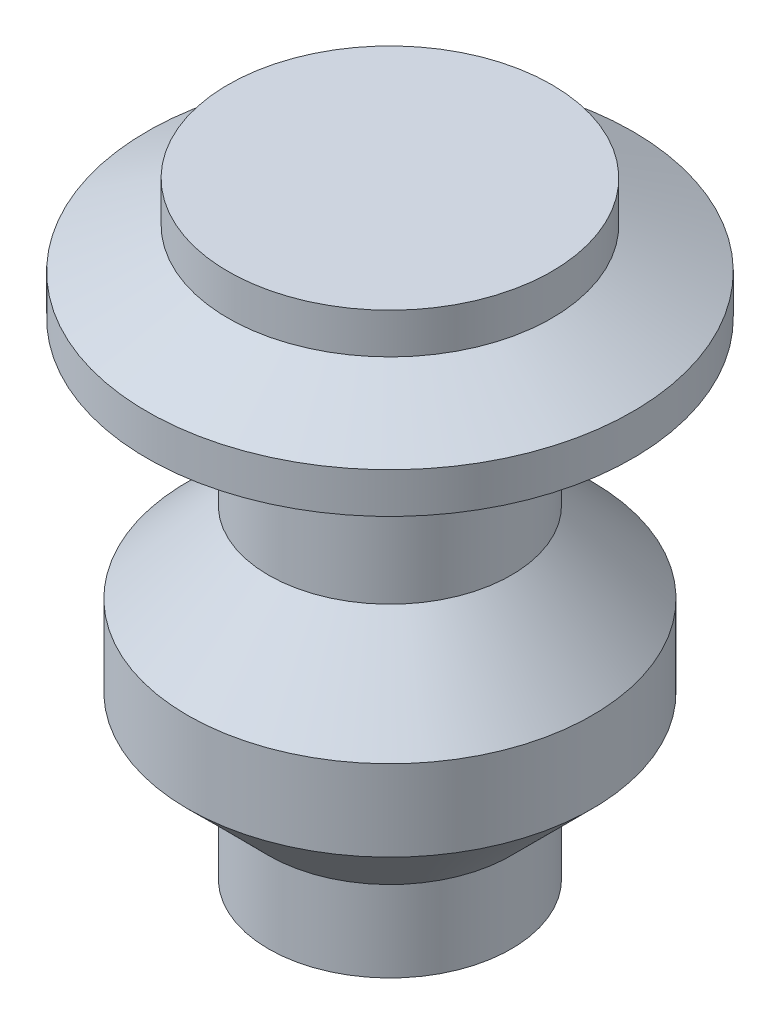
ISO-10303-21;
HEADER;
FILE_DESCRIPTION(('STEP AP214'),'2;1');
FILE_NAME('part.step','',(''),(''),'','','');
FILE_SCHEMA(('AUTOMOTIVE_DESIGN { 1 0 10303 214 1 1 1 1 }'));
ENDSEC;
DATA;
#1=APPLICATION_CONTEXT('core data for automotive mechanical design processes');
#2=APPLICATION_PROTOCOL_DEFINITION('international standard','automotive_design',2000,#1);
#3=PRODUCT_CONTEXT('',#1,'mechanical');
#4=PRODUCT('Part','Part','',(#3));
#5=PRODUCT_RELATED_PRODUCT_CATEGORY('part','',(#4));
#6=PRODUCT_DEFINITION_FORMATION('','',#4);
#7=PRODUCT_DEFINITION_CONTEXT('part definition',#1,'design');
#8=PRODUCT_DEFINITION('design','',#6,#7);
#9=PRODUCT_DEFINITION_SHAPE('','',#8);
#10=(LENGTH_UNIT() NAMED_UNIT(*) SI_UNIT(.MILLI.,.METRE.));
#11=(NAMED_UNIT(*) PLANE_ANGLE_UNIT() SI_UNIT($,.RADIAN.));
#12=(NAMED_UNIT(*) SI_UNIT($,.STERADIAN.) SOLID_ANGLE_UNIT());
#13=UNCERTAINTY_MEASURE_WITH_UNIT(LENGTH_MEASURE(1.E-05),#10,'distance_accuracy_value','');
#14=(GEOMETRIC_REPRESENTATION_CONTEXT(3) GLOBAL_UNCERTAINTY_ASSIGNED_CONTEXT((#13)) GLOBAL_UNIT_ASSIGNED_CONTEXT((#10,
#11,#12)) REPRESENTATION_CONTEXT('',''));
#15=CARTESIAN_POINT('',(0.,0.,0.));
#16=DIRECTION('',(0.,0.,1.));
#17=DIRECTION('',(1.,0.,0.));
#18=AXIS2_PLACEMENT_3D('',#15,#16,#17);
#19=CARTESIAN_POINT('',(0.,0.,0.));
#20=DIRECTION('',(0.,-1.,0.));
#21=DIRECTION('',(0.,0.,-1.));
#22=AXIS2_PLACEMENT_3D('',#19,#20,#21);
#23=PLANE('',#22);
#24=CARTESIAN_POINT('',(0.,0.,0.));
#25=DIRECTION('',(0.,-1.,0.));
#26=DIRECTION('',(0.,0.,-1.));
#27=AXIS2_PLACEMENT_3D('',#24,#25,#26);
#28=CIRCLE('',#27,30.);
#29=CARTESIAN_POINT('',(0.,0.,-30.));
#30=VERTEX_POINT('',#29);
#31=EDGE_CURVE('E10',#30,#30,#28,.T.);
#32=ORIENTED_EDGE('',*,*,#31,.T.);
#33=EDGE_LOOP('',(#32));
#34=FACE_BOUND('',#33,.T.);
#35=ADVANCED_FACE('F39',(#34),#23,.T.);
#36=CARTESIAN_POINT('',(0.,0.,0.));
#37=DIRECTION('',(0.,-1.,0.));
#38=DIRECTION('',(0.,0.,-1.));
#39=AXIS2_PLACEMENT_3D('',#36,#37,#38);
#40=CYLINDRICAL_SURFACE('',#39,30.);
#41=CARTESIAN_POINT('',(0.,20.,0.));
#42=DIRECTION('',(0.,-1.,0.));
#43=DIRECTION('',(0.,0.,-1.));
#44=AXIS2_PLACEMENT_3D('',#41,#42,#43);
#45=CIRCLE('',#44,30.);
#46=CARTESIAN_POINT('',(0.,20.,-30.));
#47=VERTEX_POINT('',#46);
#48=EDGE_CURVE('E45',#47,#47,#45,.T.);
#49=ORIENTED_EDGE('',*,*,#48,.T.);
#50=EDGE_LOOP('',(#49));
#51=FACE_BOUND('',#50,.T.);
#52=ORIENTED_EDGE('',*,*,#31,.F.);
#53=EDGE_LOOP('',(#52));
#54=FACE_BOUND('',#53,.T.);
#55=ADVANCED_FACE('F89',(#51,#54),#40,.T.);
#56=CARTESIAN_POINT('',(0.,20.,0.));
#57=DIRECTION('',(0.,1.,0.));
#58=DIRECTION('',(0.,0.,1.));
#59=AXIS2_PLACEMENT_3D('',#56,#57,#58);
#60=CONICAL_SURFACE('',#59,30.,0.785398163397436);
#61=CARTESIAN_POINT('',(0.,40.0000000000003,0.));
#62=DIRECTION('',(0.,-1.,0.));
#63=DIRECTION('',(0.,0.,-1.));
#64=AXIS2_PLACEMENT_3D('',#61,#62,#63);
#65=CIRCLE('',#64,49.9999999999998);
#66=CARTESIAN_POINT('',(0.,40.0000000000003,-49.9999999999998));
#67=VERTEX_POINT('',#66);
#68=EDGE_CURVE('E49',#67,#67,#65,.T.);
#69=ORIENTED_EDGE('',*,*,#68,.T.);
#70=EDGE_LOOP('',(#69));
#71=FACE_BOUND('',#70,.T.);
#72=ORIENTED_EDGE('',*,*,#48,.F.);
#73=EDGE_LOOP('',(#72));
#74=FACE_BOUND('',#73,.T.);
#75=ADVANCED_FACE('F93',(#71,#74),#60,.T.);
#76=CARTESIAN_POINT('',(0.,0.,0.));
#77=DIRECTION('',(0.,-1.,0.));
#78=DIRECTION('',(0.,0.,-1.));
#79=AXIS2_PLACEMENT_3D('',#76,#77,#78);
#80=CYLINDRICAL_SURFACE('',#79,49.9999999999998);
#81=CARTESIAN_POINT('',(0.,60.,0.));
#82=DIRECTION('',(0.,-1.,0.));
#83=DIRECTION('',(0.,0.,-1.));
#84=AXIS2_PLACEMENT_3D('',#81,#82,#83);
#85=CIRCLE('',#84,49.9999999999998);
#86=CARTESIAN_POINT('',(0.,60.,-49.9999999999998));
#87=VERTEX_POINT('',#86);
#88=EDGE_CURVE('E53',#87,#87,#85,.T.);
#89=ORIENTED_EDGE('',*,*,#88,.T.);
#90=EDGE_LOOP('',(#89));
#91=FACE_BOUND('',#90,.T.);
#92=ORIENTED_EDGE('',*,*,#68,.F.);
#93=EDGE_LOOP('',(#92));
#94=FACE_BOUND('',#93,.T.);
#95=ADVANCED_FACE('F97',(#91,#94),#80,.T.);
#96=CARTESIAN_POINT('',(0.,60.,0.));
#97=DIRECTION('',(0.,-1.,0.));
#98=DIRECTION('',(0.,0.,-1.));
#99=AXIS2_PLACEMENT_3D('',#96,#97,#98);
#100=CONICAL_SURFACE('',#99,49.9999999999998,0.78539816339745);
#101=CARTESIAN_POINT('',(0.,79.9999999999997,0.));
#102=DIRECTION('',(0.,-1.,0.));
#103=DIRECTION('',(0.,0.,-1.));
#104=AXIS2_PLACEMENT_3D('',#101,#102,#103);
#105=CIRCLE('',#104,30.);
#106=CARTESIAN_POINT('',(0.,79.9999999999997,-30.));
#107=VERTEX_POINT('',#106);
#108=EDGE_CURVE('E58',#107,#107,#105,.T.);
#109=ORIENTED_EDGE('',*,*,#108,.T.);
#110=EDGE_LOOP('',(#109));
#111=FACE_BOUND('',#110,.T.);
#112=ORIENTED_EDGE('',*,*,#88,.F.);
#113=EDGE_LOOP('',(#112));
#114=FACE_BOUND('',#113,.T.);
#115=ADVANCED_FACE('F104',(#111,#114),#100,.T.);
#116=CARTESIAN_POINT('',(0.,0.,0.));
#117=DIRECTION('',(0.,-1.,0.));
#118=DIRECTION('',(0.,0.,-1.));
#119=AXIS2_PLACEMENT_3D('',#116,#117,#118);
#120=CYLINDRICAL_SURFACE('',#119,30.);
#121=CARTESIAN_POINT('',(0.,100.,0.));
#122=DIRECTION('',(0.,-1.,0.));
#123=DIRECTION('',(0.,0.,-1.));
#124=AXIS2_PLACEMENT_3D('',#121,#122,#123);
#125=CIRCLE('',#124,30.);
#126=CARTESIAN_POINT('',(0.,100.,-30.));
#127=VERTEX_POINT('',#126);
#128=EDGE_CURVE('E61',#127,#127,#125,.T.);
#129=ORIENTED_EDGE('',*,*,#128,.T.);
#130=EDGE_LOOP('',(#129));
#131=FACE_BOUND('',#130,.T.);
#132=ORIENTED_EDGE('',*,*,#108,.F.);
#133=EDGE_LOOP('',(#132));
#134=FACE_BOUND('',#133,.T.);
#135=ADVANCED_FACE('F108',(#131,#134),#120,.T.);
#136=CARTESIAN_POINT('',(0.,100.,0.));
#137=DIRECTION('',(0.,1.,0.));
#138=DIRECTION('',(0.,0.,1.));
#139=AXIS2_PLACEMENT_3D('',#136,#137,#138);
#140=CONICAL_SURFACE('',#139,30.,0.982793723247329);
#141=CARTESIAN_POINT('',(0.,120.,0.));
#142=DIRECTION('',(0.,-1.,0.));
#143=DIRECTION('',(0.,0.,-1.));
#144=AXIS2_PLACEMENT_3D('',#141,#142,#143);
#145=CIRCLE('',#144,60.);
#146=CARTESIAN_POINT('',(0.,120.,-60.));
#147=VERTEX_POINT('',#146);
#148=EDGE_CURVE('E64',#147,#147,#145,.T.);
#149=ORIENTED_EDGE('',*,*,#148,.T.);
#150=EDGE_LOOP('',(#149));
#151=FACE_BOUND('',#150,.T.);
#152=ORIENTED_EDGE('',*,*,#128,.F.);
#153=EDGE_LOOP('',(#152));
#154=FACE_BOUND('',#153,.T.);
#155=ADVANCED_FACE('F112',(#151,#154),#140,.T.);
#156=CARTESIAN_POINT('',(0.,0.,0.));
#157=DIRECTION('',(0.,-1.,0.));
#158=DIRECTION('',(0.,0.,-1.));
#159=AXIS2_PLACEMENT_3D('',#156,#157,#158);
#160=CYLINDRICAL_SURFACE('',#159,60.);
#161=CARTESIAN_POINT('',(0.,130.,0.));
#162=DIRECTION('',(0.,-1.,0.));
#163=DIRECTION('',(0.,0.,-1.));
#164=AXIS2_PLACEMENT_3D('',#161,#162,#163);
#165=CIRCLE('',#164,60.);
#166=CARTESIAN_POINT('',(0.,130.,-60.));
#167=VERTEX_POINT('',#166);
#168=EDGE_CURVE('E67',#167,#167,#165,.T.);
#169=ORIENTED_EDGE('',*,*,#168,.T.);
#170=EDGE_LOOP('',(#169));
#171=FACE_BOUND('',#170,.T.);
#172=ORIENTED_EDGE('',*,*,#148,.F.);
#173=EDGE_LOOP('',(#172));
#174=FACE_BOUND('',#173,.T.);
#175=ADVANCED_FACE('F116',(#171,#174),#160,.T.);
#176=CARTESIAN_POINT('',(0.,130.,0.));
#177=DIRECTION('',(0.,-1.,0.));
#178=DIRECTION('',(0.,0.,-1.));
#179=AXIS2_PLACEMENT_3D('',#176,#177,#178);
#180=CONICAL_SURFACE('',#179,60.,1.10714871779409);
#181=CARTESIAN_POINT('',(0.,140.,0.));
#182=DIRECTION('',(0.,-1.,0.));
#183=DIRECTION('',(0.,0.,-1.));
#184=AXIS2_PLACEMENT_3D('',#181,#182,#183);
#185=CIRCLE('',#184,40.);
#186=CARTESIAN_POINT('',(0.,140.,-40.));
#187=VERTEX_POINT('',#186);
#188=EDGE_CURVE('E70',#187,#187,#185,.T.);
#189=ORIENTED_EDGE('',*,*,#188,.T.);
#190=EDGE_LOOP('',(#189));
#191=FACE_BOUND('',#190,.T.);
#192=ORIENTED_EDGE('',*,*,#168,.F.);
#193=EDGE_LOOP('',(#192));
#194=FACE_BOUND('',#193,.T.);
#195=ADVANCED_FACE('F86',(#191,#194),#180,.T.);
#196=CARTESIAN_POINT('',(0.,0.,0.));
#197=DIRECTION('',(0.,-1.,0.));
#198=DIRECTION('',(0.,0.,-1.));
#199=AXIS2_PLACEMENT_3D('',#196,#197,#198);
#200=CYLINDRICAL_SURFACE('',#199,40.);
#201=CARTESIAN_POINT('',(0.,150.,0.));
#202=DIRECTION('',(0.,-1.,0.));
#203=DIRECTION('',(0.,0.,-1.));
#204=AXIS2_PLACEMENT_3D('',#201,#202,#203);
#205=CIRCLE('',#204,40.);
#206=CARTESIAN_POINT('',(0.,150.,-40.));
#207=VERTEX_POINT('',#206);
#208=EDGE_CURVE('E73',#207,#207,#205,.T.);
#209=ORIENTED_EDGE('',*,*,#208,.T.);
#210=EDGE_LOOP('',(#209));
#211=FACE_BOUND('',#210,.T.);
#212=ORIENTED_EDGE('',*,*,#188,.F.);
#213=EDGE_LOOP('',(#212));
#214=FACE_BOUND('',#213,.T.);
#215=ADVANCED_FACE('F77',(#211,#214),#200,.T.);
#216=CARTESIAN_POINT('',(40.,150.,0.));
#217=DIRECTION('',(0.,1.,0.));
#218=DIRECTION('',(0.,0.,1.));
#219=AXIS2_PLACEMENT_3D('',#216,#217,#218);
#220=PLANE('',#219);
#221=ORIENTED_EDGE('',*,*,#208,.F.);
#222=EDGE_LOOP('',(#221));
#223=FACE_BOUND('',#222,.T.);
#224=ADVANCED_FACE('F80',(#223),#220,.T.);
#225=CLOSED_SHELL('',(#35,#55,#75,#95,#115,#135,#155,#175,#195,#215,#224));
#226=MANIFOLD_SOLID_BREP('B2',#225);
#227=ADVANCED_BREP_SHAPE_REPRESENTATION('',(#18,#226),#14);
#228=SHAPE_DEFINITION_REPRESENTATION(#9,#227);
ENDSEC;
END-ISO-10303-21;
